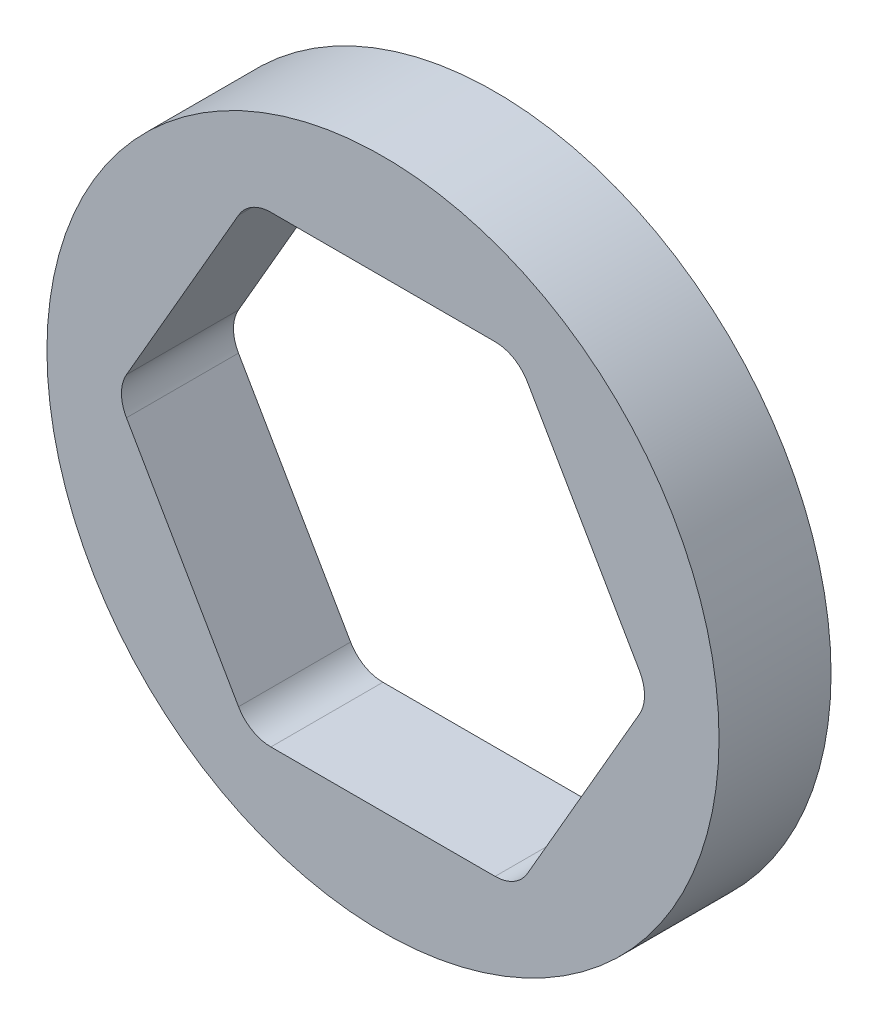
ISO-10303-21;
HEADER;
FILE_DESCRIPTION(('STEP AP214'),'2;1');
FILE_NAME('part.step','',(''),(''),'','','');
FILE_SCHEMA(('AUTOMOTIVE_DESIGN { 1 0 10303 214 1 1 1 1 }'));
ENDSEC;
DATA;
#1=APPLICATION_CONTEXT('core data for automotive mechanical design processes');
#2=APPLICATION_PROTOCOL_DEFINITION('international standard','automotive_design',2000,#1);
#3=PRODUCT_CONTEXT('',#1,'mechanical');
#4=PRODUCT('Part','Part','',(#3));
#5=PRODUCT_RELATED_PRODUCT_CATEGORY('part','',(#4));
#6=PRODUCT_DEFINITION_FORMATION('','',#4);
#7=PRODUCT_DEFINITION_CONTEXT('part definition',#1,'design');
#8=PRODUCT_DEFINITION('design','',#6,#7);
#9=PRODUCT_DEFINITION_SHAPE('','',#8);
#10=(LENGTH_UNIT() NAMED_UNIT(*) SI_UNIT(.MILLI.,.METRE.));
#11=(NAMED_UNIT(*) PLANE_ANGLE_UNIT() SI_UNIT($,.RADIAN.));
#12=(NAMED_UNIT(*) SI_UNIT($,.STERADIAN.) SOLID_ANGLE_UNIT());
#13=UNCERTAINTY_MEASURE_WITH_UNIT(LENGTH_MEASURE(1.E-05),#10,'distance_accuracy_value','');
#14=(GEOMETRIC_REPRESENTATION_CONTEXT(3) GLOBAL_UNCERTAINTY_ASSIGNED_CONTEXT((#13)) GLOBAL_UNIT_ASSIGNED_CONTEXT((#10,
#11,#12)) REPRESENTATION_CONTEXT('',''));
#15=CARTESIAN_POINT('',(0.,0.,0.));
#16=DIRECTION('',(0.,0.,1.));
#17=DIRECTION('',(1.,0.,0.));
#18=AXIS2_PLACEMENT_3D('',#15,#16,#17);
#19=CARTESIAN_POINT('',(0.,0.,0.));
#20=DIRECTION('',(0.,0.,1.));
#21=DIRECTION('',(1.,0.,0.));
#22=AXIS2_PLACEMENT_3D('',#19,#20,#21);
#23=CYLINDRICAL_SURFACE('',#22,9.);
#24=CARTESIAN_POINT('',(0.,0.,0.));
#25=DIRECTION('',(0.,0.,1.));
#26=DIRECTION('',(-1.,0.,0.));
#27=AXIS2_PLACEMENT_3D('',#24,#25,#26);
#28=CIRCLE('',#27,9.);
#29=CARTESIAN_POINT('',(-9.,0.,0.));
#30=VERTEX_POINT('',#29);
#31=EDGE_CURVE('E11',#30,#30,#28,.T.);
#32=ORIENTED_EDGE('',*,*,#31,.T.);
#33=EDGE_LOOP('',(#32));
#34=FACE_BOUND('',#33,.T.);
#35=CARTESIAN_POINT('',(0.,0.,3.));
#36=DIRECTION('',(0.,0.,1.));
#37=DIRECTION('',(-1.,0.,0.));
#38=AXIS2_PLACEMENT_3D('',#35,#36,#37);
#39=CIRCLE('',#38,9.);
#40=CARTESIAN_POINT('',(-9.,0.,3.));
#41=VERTEX_POINT('',#40);
#42=EDGE_CURVE('E46',#41,#41,#39,.T.);
#43=ORIENTED_EDGE('',*,*,#42,.F.);
#44=EDGE_LOOP('',(#43));
#45=FACE_BOUND('',#44,.T.);
#46=ADVANCED_FACE('F43',(#34,#45),#23,.T.);
#47=CARTESIAN_POINT('',(0.,0.,0.));
#48=DIRECTION('',(0.,0.,-1.));
#49=DIRECTION('',(-1.,0.,0.));
#50=AXIS2_PLACEMENT_3D('',#47,#48,#49);
#51=PLANE('',#50);
#52=CARTESIAN_POINT('',(-3.00222139978606,5.2,0.));
#53=DIRECTION('',(0.,0.,1.));
#54=DIRECTION('',(-1.,0.,0.));
#55=AXIS2_PLACEMENT_3D('',#52,#53,#54);
#56=CIRCLE('',#55,1.);
#57=CARTESIAN_POINT('',(-3.00222139978606,6.2,0.));
#58=VERTEX_POINT('',#57);
#59=CARTESIAN_POINT('',(-3.8682468035705,5.7,0.));
#60=VERTEX_POINT('',#59);
#61=EDGE_CURVE('E134',#58,#60,#56,.T.);
#62=ORIENTED_EDGE('',*,*,#61,.T.);
#63=DIRECTION('',(-0.5,-0.866025403784439,0.));
#64=VECTOR('',#63,1.);
#65=CARTESIAN_POINT('',(-6.87046820335655,0.5,0.));
#66=LINE('',#65,#64);
#67=CARTESIAN_POINT('',(-6.87046820335655,0.5,0.));
#68=VERTEX_POINT('',#67);
#69=EDGE_CURVE('E144',#60,#68,#66,.T.);
#70=ORIENTED_EDGE('',*,*,#69,.T.);
#71=CARTESIAN_POINT('',(-6.00444279957211,0.,0.));
#72=DIRECTION('',(0.,0.,1.));
#73=DIRECTION('',(-1.,0.,0.));
#74=AXIS2_PLACEMENT_3D('',#71,#72,#73);
#75=CIRCLE('',#74,1.);
#76=CARTESIAN_POINT('',(-6.87046820335655,-0.5,0.));
#77=VERTEX_POINT('',#76);
#78=EDGE_CURVE('E58',#68,#77,#75,.T.);
#79=ORIENTED_EDGE('',*,*,#78,.T.);
#80=DIRECTION('',(0.5,-0.866025403784439,0.));
#81=VECTOR('',#80,1.);
#82=CARTESIAN_POINT('',(-3.8682468035705,-5.7,0.));
#83=LINE('',#82,#81);
#84=CARTESIAN_POINT('',(-3.86824680357049,-5.7,0.));
#85=VERTEX_POINT('',#84);
#86=EDGE_CURVE('E163',#77,#85,#83,.T.);
#87=ORIENTED_EDGE('',*,*,#86,.T.);
#88=CARTESIAN_POINT('',(-3.00222139978606,-5.2,0.));
#89=DIRECTION('',(0.,0.,1.));
#90=DIRECTION('',(-1.,0.,0.));
#91=AXIS2_PLACEMENT_3D('',#88,#89,#90);
#92=CIRCLE('',#91,1.);
#93=CARTESIAN_POINT('',(-3.00222139978606,-6.2,0.));
#94=VERTEX_POINT('',#93);
#95=EDGE_CURVE('E167',#85,#94,#92,.T.);
#96=ORIENTED_EDGE('',*,*,#95,.T.);
#97=DIRECTION('',(1.,0.,0.));
#98=VECTOR('',#97,1.);
#99=CARTESIAN_POINT('',(3.00222139978606,-6.2,0.));
#100=LINE('',#99,#98);
#101=CARTESIAN_POINT('',(3.00222139978606,-6.2,0.));
#102=VERTEX_POINT('',#101);
#103=EDGE_CURVE('E171',#94,#102,#100,.T.);
#104=ORIENTED_EDGE('',*,*,#103,.T.);
#105=CARTESIAN_POINT('',(3.00222139978606,-5.2,0.));
#106=DIRECTION('',(0.,0.,1.));
#107=DIRECTION('',(-1.,0.,0.));
#108=AXIS2_PLACEMENT_3D('',#105,#106,#107);
#109=CIRCLE('',#108,0.999999999999999);
#110=CARTESIAN_POINT('',(3.86824680357049,-5.7,0.));
#111=VERTEX_POINT('',#110);
#112=EDGE_CURVE('E175',#102,#111,#109,.T.);
#113=ORIENTED_EDGE('',*,*,#112,.T.);
#114=DIRECTION('',(0.500000000000001,0.866025403784438,0.));
#115=VECTOR('',#114,1.);
#116=CARTESIAN_POINT('',(6.87046820335655,-0.5,0.));
#117=LINE('',#116,#115);
#118=CARTESIAN_POINT('',(6.87046820335655,-0.5,0.));
#119=VERTEX_POINT('',#118);
#120=EDGE_CURVE('E179',#111,#119,#117,.T.);
#121=ORIENTED_EDGE('',*,*,#120,.T.);
#122=CARTESIAN_POINT('',(6.00444279957211,0.,0.));
#123=DIRECTION('',(0.,0.,1.));
#124=DIRECTION('',(-1.,0.,0.));
#125=AXIS2_PLACEMENT_3D('',#122,#123,#124);
#126=CIRCLE('',#125,1.);
#127=CARTESIAN_POINT('',(6.87046820335655,0.5,0.));
#128=VERTEX_POINT('',#127);
#129=EDGE_CURVE('E183',#119,#128,#126,.T.);
#130=ORIENTED_EDGE('',*,*,#129,.T.);
#131=DIRECTION('',(-0.5,0.866025403784439,0.));
#132=VECTOR('',#131,1.);
#133=CARTESIAN_POINT('',(3.8682468035705,5.7,0.));
#134=LINE('',#133,#132);
#135=CARTESIAN_POINT('',(3.86824680357049,5.7,0.));
#136=VERTEX_POINT('',#135);
#137=EDGE_CURVE('E187',#128,#136,#134,.T.);
#138=ORIENTED_EDGE('',*,*,#137,.T.);
#139=CARTESIAN_POINT('',(3.00222139978606,5.2,0.));
#140=DIRECTION('',(0.,0.,1.));
#141=DIRECTION('',(-1.,0.,0.));
#142=AXIS2_PLACEMENT_3D('',#139,#140,#141);
#143=CIRCLE('',#142,1.);
#144=CARTESIAN_POINT('',(3.00222139978606,6.2,0.));
#145=VERTEX_POINT('',#144);
#146=EDGE_CURVE('E191',#136,#145,#143,.T.);
#147=ORIENTED_EDGE('',*,*,#146,.T.);
#148=DIRECTION('',(-1.,0.,0.));
#149=VECTOR('',#148,1.);
#150=CARTESIAN_POINT('',(-3.00222139978606,6.2,0.));
#151=LINE('',#150,#149);
#152=EDGE_CURVE('E141',#145,#58,#151,.T.);
#153=ORIENTED_EDGE('',*,*,#152,.T.);
#154=EDGE_LOOP('',(#62,#70,#79,#87,#96,#104,#113,#121,#130,#138,#147,#153));
#155=FACE_BOUND('',#154,.T.);
#156=ORIENTED_EDGE('',*,*,#31,.F.);
#157=EDGE_LOOP('',(#156));
#158=FACE_BOUND('',#157,.T.);
#159=ADVANCED_FACE('F149',(#155,#158),#51,.T.);
#160=CARTESIAN_POINT('',(0.,0.,3.));
#161=DIRECTION('',(0.,0.,-1.));
#162=DIRECTION('',(-1.,0.,0.));
#163=AXIS2_PLACEMENT_3D('',#160,#161,#162);
#164=PLANE('',#163);
#165=DIRECTION('',(-0.5,-0.866025403784439,0.));
#166=VECTOR('',#165,1.);
#167=CARTESIAN_POINT('',(-6.87046820335655,0.5,3.));
#168=LINE('',#167,#166);
#169=CARTESIAN_POINT('',(-3.8682468035705,5.7,3.));
#170=VERTEX_POINT('',#169);
#171=CARTESIAN_POINT('',(-6.87046820335655,0.5,3.));
#172=VERTEX_POINT('',#171);
#173=EDGE_CURVE('E198',#170,#172,#168,.T.);
#174=ORIENTED_EDGE('',*,*,#173,.F.);
#175=CARTESIAN_POINT('',(-3.00222139978606,5.2,3.));
#176=DIRECTION('',(0.,0.,1.));
#177=DIRECTION('',(-1.,0.,0.));
#178=AXIS2_PLACEMENT_3D('',#175,#176,#177);
#179=CIRCLE('',#178,1.);
#180=CARTESIAN_POINT('',(-3.00222139978606,6.2,3.));
#181=VERTEX_POINT('',#180);
#182=EDGE_CURVE('E66',#181,#170,#179,.T.);
#183=ORIENTED_EDGE('',*,*,#182,.F.);
#184=DIRECTION('',(-1.,0.,0.));
#185=VECTOR('',#184,1.);
#186=CARTESIAN_POINT('',(-3.00222139978606,6.2,3.));
#187=LINE('',#186,#185);
#188=CARTESIAN_POINT('',(3.00222139978606,6.2,3.));
#189=VERTEX_POINT('',#188);
#190=EDGE_CURVE('E154',#189,#181,#187,.T.);
#191=ORIENTED_EDGE('',*,*,#190,.F.);
#192=CARTESIAN_POINT('',(3.00222139978606,5.2,3.));
#193=DIRECTION('',(0.,0.,1.));
#194=DIRECTION('',(-1.,0.,0.));
#195=AXIS2_PLACEMENT_3D('',#192,#193,#194);
#196=CIRCLE('',#195,1.);
#197=CARTESIAN_POINT('',(3.86824680357049,5.7,3.));
#198=VERTEX_POINT('',#197);
#199=EDGE_CURVE('E158',#198,#189,#196,.T.);
#200=ORIENTED_EDGE('',*,*,#199,.F.);
#201=DIRECTION('',(-0.5,0.866025403784439,0.));
#202=VECTOR('',#201,1.);
#203=CARTESIAN_POINT('',(3.8682468035705,5.7,3.));
#204=LINE('',#203,#202);
#205=CARTESIAN_POINT('',(6.87046820335655,0.5,3.));
#206=VERTEX_POINT('',#205);
#207=EDGE_CURVE('E229',#206,#198,#204,.T.);
#208=ORIENTED_EDGE('',*,*,#207,.F.);
#209=CARTESIAN_POINT('',(6.00444279957211,0.,3.));
#210=DIRECTION('',(0.,0.,1.));
#211=DIRECTION('',(-1.,0.,0.));
#212=AXIS2_PLACEMENT_3D('',#209,#210,#211);
#213=CIRCLE('',#212,1.);
#214=CARTESIAN_POINT('',(6.87046820335655,-0.5,3.));
#215=VERTEX_POINT('',#214);
#216=EDGE_CURVE('E225',#215,#206,#213,.T.);
#217=ORIENTED_EDGE('',*,*,#216,.F.);
#218=DIRECTION('',(0.500000000000001,0.866025403784438,0.));
#219=VECTOR('',#218,1.);
#220=CARTESIAN_POINT('',(6.87046820335655,-0.5,3.));
#221=LINE('',#220,#219);
#222=CARTESIAN_POINT('',(3.86824680357049,-5.7,3.));
#223=VERTEX_POINT('',#222);
#224=EDGE_CURVE('E221',#223,#215,#221,.T.);
#225=ORIENTED_EDGE('',*,*,#224,.F.);
#226=CARTESIAN_POINT('',(3.00222139978606,-5.2,3.));
#227=DIRECTION('',(0.,0.,1.));
#228=DIRECTION('',(-1.,0.,0.));
#229=AXIS2_PLACEMENT_3D('',#226,#227,#228);
#230=CIRCLE('',#229,0.999999999999999);
#231=CARTESIAN_POINT('',(3.00222139978606,-6.2,3.));
#232=VERTEX_POINT('',#231);
#233=EDGE_CURVE('E217',#232,#223,#230,.T.);
#234=ORIENTED_EDGE('',*,*,#233,.F.);
#235=DIRECTION('',(1.,0.,0.));
#236=VECTOR('',#235,1.);
#237=CARTESIAN_POINT('',(3.00222139978606,-6.2,3.));
#238=LINE('',#237,#236);
#239=CARTESIAN_POINT('',(-3.00222139978606,-6.2,3.));
#240=VERTEX_POINT('',#239);
#241=EDGE_CURVE('E213',#240,#232,#238,.T.);
#242=ORIENTED_EDGE('',*,*,#241,.F.);
#243=CARTESIAN_POINT('',(-3.00222139978606,-5.2,3.));
#244=DIRECTION('',(0.,0.,1.));
#245=DIRECTION('',(-1.,0.,0.));
#246=AXIS2_PLACEMENT_3D('',#243,#244,#245);
#247=CIRCLE('',#246,1.);
#248=CARTESIAN_POINT('',(-3.86824680357049,-5.7,3.));
#249=VERTEX_POINT('',#248);
#250=EDGE_CURVE('E209',#249,#240,#247,.T.);
#251=ORIENTED_EDGE('',*,*,#250,.F.);
#252=DIRECTION('',(0.5,-0.866025403784439,0.));
#253=VECTOR('',#252,1.);
#254=CARTESIAN_POINT('',(-3.8682468035705,-5.7,3.));
#255=LINE('',#254,#253);
#256=CARTESIAN_POINT('',(-6.87046820335655,-0.5,3.));
#257=VERTEX_POINT('',#256);
#258=EDGE_CURVE('E205',#257,#249,#255,.T.);
#259=ORIENTED_EDGE('',*,*,#258,.F.);
#260=CARTESIAN_POINT('',(-6.00444279957211,0.,3.));
#261=DIRECTION('',(0.,0.,1.));
#262=DIRECTION('',(-1.,0.,0.));
#263=AXIS2_PLACEMENT_3D('',#260,#261,#262);
#264=CIRCLE('',#263,1.);
#265=EDGE_CURVE('E201',#172,#257,#264,.T.);
#266=ORIENTED_EDGE('',*,*,#265,.F.);
#267=EDGE_LOOP('',(#174,#183,#191,#200,#208,#217,#225,#234,#242,#251,#259,#266));
#268=FACE_BOUND('',#267,.T.);
#269=ORIENTED_EDGE('',*,*,#42,.T.);
#270=EDGE_LOOP('',(#269));
#271=FACE_BOUND('',#270,.T.);
#272=ADVANCED_FACE('F271',(#268,#271),#164,.F.);
#273=CARTESIAN_POINT('',(-3.00222139978606,5.2,0.));
#274=DIRECTION('',(0.,0.,1.));
#275=DIRECTION('',(1.,0.,0.));
#276=AXIS2_PLACEMENT_3D('',#273,#274,#275);
#277=CYLINDRICAL_SURFACE('',#276,1.);
#278=ORIENTED_EDGE('',*,*,#182,.T.);
#279=DIRECTION('',(0.,0.,1.));
#280=VECTOR('',#279,1.);
#281=CARTESIAN_POINT('',(-3.8682468035705,5.7,0.));
#282=LINE('',#281,#280);
#283=EDGE_CURVE('E130',#60,#170,#282,.T.);
#284=ORIENTED_EDGE('',*,*,#283,.F.);
#285=ORIENTED_EDGE('',*,*,#61,.F.);
#286=DIRECTION('',(0.,0.,1.));
#287=VECTOR('',#286,1.);
#288=CARTESIAN_POINT('',(-3.00222139978606,6.2,0.));
#289=LINE('',#288,#287);
#290=EDGE_CURVE('E236',#58,#181,#289,.T.);
#291=ORIENTED_EDGE('',*,*,#290,.T.);
#292=EDGE_LOOP('',(#278,#284,#285,#291));
#293=FACE_BOUND('',#292,.T.);
#294=ADVANCED_FACE('F132',(#293),#277,.F.);
#295=CARTESIAN_POINT('',(-3.00222139978606,6.2,0.));
#296=DIRECTION('',(0.,1.,0.));
#297=DIRECTION('',(0.,0.,1.));
#298=AXIS2_PLACEMENT_3D('',#295,#296,#297);
#299=PLANE('',#298);
#300=ORIENTED_EDGE('',*,*,#190,.T.);
#301=ORIENTED_EDGE('',*,*,#290,.F.);
#302=ORIENTED_EDGE('',*,*,#152,.F.);
#303=DIRECTION('',(0.,0.,1.));
#304=VECTOR('',#303,1.);
#305=CARTESIAN_POINT('',(3.00222139978606,6.2,0.));
#306=LINE('',#305,#304);
#307=EDGE_CURVE('E239',#145,#189,#306,.T.);
#308=ORIENTED_EDGE('',*,*,#307,.T.);
#309=EDGE_LOOP('',(#300,#301,#302,#308));
#310=FACE_BOUND('',#309,.T.);
#311=ADVANCED_FACE('F306',(#310),#299,.F.);
#312=CARTESIAN_POINT('',(3.00222139978606,5.2,0.));
#313=DIRECTION('',(0.,0.,1.));
#314=DIRECTION('',(1.,0.,0.));
#315=AXIS2_PLACEMENT_3D('',#312,#313,#314);
#316=CYLINDRICAL_SURFACE('',#315,1.);
#317=ORIENTED_EDGE('',*,*,#199,.T.);
#318=ORIENTED_EDGE('',*,*,#307,.F.);
#319=ORIENTED_EDGE('',*,*,#146,.F.);
#320=DIRECTION('',(0.,0.,1.));
#321=VECTOR('',#320,1.);
#322=CARTESIAN_POINT('',(3.86824680357049,5.7,0.));
#323=LINE('',#322,#321);
#324=EDGE_CURVE('E242',#136,#198,#323,.T.);
#325=ORIENTED_EDGE('',*,*,#324,.T.);
#326=EDGE_LOOP('',(#317,#318,#319,#325));
#327=FACE_BOUND('',#326,.T.);
#328=ADVANCED_FACE('F302',(#327),#316,.F.);
#329=CARTESIAN_POINT('',(3.8682468035705,5.7,0.));
#330=DIRECTION('',(0.866025403784439,0.5,0.));
#331=DIRECTION('',(-0.5,0.866025403784439,0.));
#332=AXIS2_PLACEMENT_3D('',#329,#330,#331);
#333=PLANE('',#332);
#334=ORIENTED_EDGE('',*,*,#207,.T.);
#335=ORIENTED_EDGE('',*,*,#324,.F.);
#336=ORIENTED_EDGE('',*,*,#137,.F.);
#337=DIRECTION('',(0.,0.,1.));
#338=VECTOR('',#337,1.);
#339=CARTESIAN_POINT('',(6.87046820335655,0.5,0.));
#340=LINE('',#339,#338);
#341=EDGE_CURVE('E245',#128,#206,#340,.T.);
#342=ORIENTED_EDGE('',*,*,#341,.T.);
#343=EDGE_LOOP('',(#334,#335,#336,#342));
#344=FACE_BOUND('',#343,.T.);
#345=ADVANCED_FACE('F299',(#344),#333,.F.);
#346=CARTESIAN_POINT('',(6.00444279957211,0.,0.));
#347=DIRECTION('',(0.,0.,1.));
#348=DIRECTION('',(1.,0.,0.));
#349=AXIS2_PLACEMENT_3D('',#346,#347,#348);
#350=CYLINDRICAL_SURFACE('',#349,1.);
#351=ORIENTED_EDGE('',*,*,#216,.T.);
#352=ORIENTED_EDGE('',*,*,#341,.F.);
#353=ORIENTED_EDGE('',*,*,#129,.F.);
#354=DIRECTION('',(0.,0.,1.));
#355=VECTOR('',#354,1.);
#356=CARTESIAN_POINT('',(6.87046820335655,-0.5,0.));
#357=LINE('',#356,#355);
#358=EDGE_CURVE('E248',#119,#215,#357,.T.);
#359=ORIENTED_EDGE('',*,*,#358,.T.);
#360=EDGE_LOOP('',(#351,#352,#353,#359));
#361=FACE_BOUND('',#360,.T.);
#362=ADVANCED_FACE('F295',(#361),#350,.F.);
#363=CARTESIAN_POINT('',(6.87046820335655,-0.5,0.));
#364=DIRECTION('',(0.866025403784438,-0.500000000000001,0.));
#365=DIRECTION('',(0.500000000000001,0.866025403784438,0.));
#366=AXIS2_PLACEMENT_3D('',#363,#364,#365);
#367=PLANE('',#366);
#368=ORIENTED_EDGE('',*,*,#224,.T.);
#369=ORIENTED_EDGE('',*,*,#358,.F.);
#370=ORIENTED_EDGE('',*,*,#120,.F.);
#371=DIRECTION('',(0.,0.,1.));
#372=VECTOR('',#371,1.);
#373=CARTESIAN_POINT('',(3.86824680357049,-5.7,0.));
#374=LINE('',#373,#372);
#375=EDGE_CURVE('E251',#111,#223,#374,.T.);
#376=ORIENTED_EDGE('',*,*,#375,.T.);
#377=EDGE_LOOP('',(#368,#369,#370,#376));
#378=FACE_BOUND('',#377,.T.);
#379=ADVANCED_FACE('F291',(#378),#367,.F.);
#380=CARTESIAN_POINT('',(3.00222139978606,-5.2,0.));
#381=DIRECTION('',(0.,0.,1.));
#382=DIRECTION('',(1.,0.,0.));
#383=AXIS2_PLACEMENT_3D('',#380,#381,#382);
#384=CYLINDRICAL_SURFACE('',#383,0.999999999999999);
#385=ORIENTED_EDGE('',*,*,#233,.T.);
#386=ORIENTED_EDGE('',*,*,#375,.F.);
#387=ORIENTED_EDGE('',*,*,#112,.F.);
#388=DIRECTION('',(0.,0.,1.));
#389=VECTOR('',#388,1.);
#390=CARTESIAN_POINT('',(3.00222139978606,-6.2,0.));
#391=LINE('',#390,#389);
#392=EDGE_CURVE('E254',#102,#232,#391,.T.);
#393=ORIENTED_EDGE('',*,*,#392,.T.);
#394=EDGE_LOOP('',(#385,#386,#387,#393));
#395=FACE_BOUND('',#394,.T.);
#396=ADVANCED_FACE('F287',(#395),#384,.F.);
#397=CARTESIAN_POINT('',(3.00222139978606,-6.2,0.));
#398=DIRECTION('',(0.,-1.,0.));
#399=DIRECTION('',(0.,0.,-1.));
#400=AXIS2_PLACEMENT_3D('',#397,#398,#399);
#401=PLANE('',#400);
#402=ORIENTED_EDGE('',*,*,#241,.T.);
#403=ORIENTED_EDGE('',*,*,#392,.F.);
#404=ORIENTED_EDGE('',*,*,#103,.F.);
#405=DIRECTION('',(0.,0.,1.));
#406=VECTOR('',#405,1.);
#407=CARTESIAN_POINT('',(-3.00222139978606,-6.2,0.));
#408=LINE('',#407,#406);
#409=EDGE_CURVE('E257',#94,#240,#408,.T.);
#410=ORIENTED_EDGE('',*,*,#409,.T.);
#411=EDGE_LOOP('',(#402,#403,#404,#410));
#412=FACE_BOUND('',#411,.T.);
#413=ADVANCED_FACE('F283',(#412),#401,.F.);
#414=CARTESIAN_POINT('',(-3.00222139978606,-5.2,0.));
#415=DIRECTION('',(0.,0.,1.));
#416=DIRECTION('',(1.,0.,0.));
#417=AXIS2_PLACEMENT_3D('',#414,#415,#416);
#418=CYLINDRICAL_SURFACE('',#417,1.);
#419=ORIENTED_EDGE('',*,*,#250,.T.);
#420=ORIENTED_EDGE('',*,*,#409,.F.);
#421=ORIENTED_EDGE('',*,*,#95,.F.);
#422=DIRECTION('',(0.,0.,1.));
#423=VECTOR('',#422,1.);
#424=CARTESIAN_POINT('',(-3.86824680357049,-5.7,0.));
#425=LINE('',#424,#423);
#426=EDGE_CURVE('E260',#85,#249,#425,.T.);
#427=ORIENTED_EDGE('',*,*,#426,.T.);
#428=EDGE_LOOP('',(#419,#420,#421,#427));
#429=FACE_BOUND('',#428,.T.);
#430=ADVANCED_FACE('F281',(#429),#418,.F.);
#431=CARTESIAN_POINT('',(-3.8682468035705,-5.7,0.));
#432=DIRECTION('',(-0.866025403784439,-0.5,0.));
#433=DIRECTION('',(0.5,-0.866025403784439,0.));
#434=AXIS2_PLACEMENT_3D('',#431,#432,#433);
#435=PLANE('',#434);
#436=ORIENTED_EDGE('',*,*,#258,.T.);
#437=ORIENTED_EDGE('',*,*,#426,.F.);
#438=ORIENTED_EDGE('',*,*,#86,.F.);
#439=DIRECTION('',(0.,0.,1.));
#440=VECTOR('',#439,1.);
#441=CARTESIAN_POINT('',(-6.87046820335655,-0.5,0.));
#442=LINE('',#441,#440);
#443=EDGE_CURVE('E263',#77,#257,#442,.T.);
#444=ORIENTED_EDGE('',*,*,#443,.T.);
#445=EDGE_LOOP('',(#436,#437,#438,#444));
#446=FACE_BOUND('',#445,.T.);
#447=ADVANCED_FACE('F276',(#446),#435,.F.);
#448=CARTESIAN_POINT('',(-6.00444279957211,0.,0.));
#449=DIRECTION('',(0.,0.,1.));
#450=DIRECTION('',(1.,0.,0.));
#451=AXIS2_PLACEMENT_3D('',#448,#449,#450);
#452=CYLINDRICAL_SURFACE('',#451,1.);
#453=ORIENTED_EDGE('',*,*,#265,.T.);
#454=ORIENTED_EDGE('',*,*,#443,.F.);
#455=ORIENTED_EDGE('',*,*,#78,.F.);
#456=DIRECTION('',(0.,0.,1.));
#457=VECTOR('',#456,1.);
#458=CARTESIAN_POINT('',(-6.87046820335655,0.5,0.));
#459=LINE('',#458,#457);
#460=EDGE_CURVE('E140',#68,#172,#459,.T.);
#461=ORIENTED_EDGE('',*,*,#460,.T.);
#462=EDGE_LOOP('',(#453,#454,#455,#461));
#463=FACE_BOUND('',#462,.T.);
#464=ADVANCED_FACE('F267',(#463),#452,.F.);
#465=CARTESIAN_POINT('',(-6.87046820335655,0.5,0.));
#466=DIRECTION('',(-0.866025403784439,0.5,0.));
#467=DIRECTION('',(-0.5,-0.866025403784439,0.));
#468=AXIS2_PLACEMENT_3D('',#465,#466,#467);
#469=PLANE('',#468);
#470=ORIENTED_EDGE('',*,*,#173,.T.);
#471=ORIENTED_EDGE('',*,*,#460,.F.);
#472=ORIENTED_EDGE('',*,*,#69,.F.);
#473=ORIENTED_EDGE('',*,*,#283,.T.);
#474=EDGE_LOOP('',(#470,#471,#472,#473));
#475=FACE_BOUND('',#474,.T.);
#476=ADVANCED_FACE('F145',(#475),#469,.F.);
#477=CLOSED_SHELL('',(#46,#159,#272,#294,#311,#328,#345,#362,#379,#396,#413,#430,#447,#464,#476));
#478=MANIFOLD_SOLID_BREP('B2',#477);
#479=ADVANCED_BREP_SHAPE_REPRESENTATION('',(#18,#478),#14);
#480=SHAPE_DEFINITION_REPRESENTATION(#9,#479);
ENDSEC;
END-ISO-10303-21;
